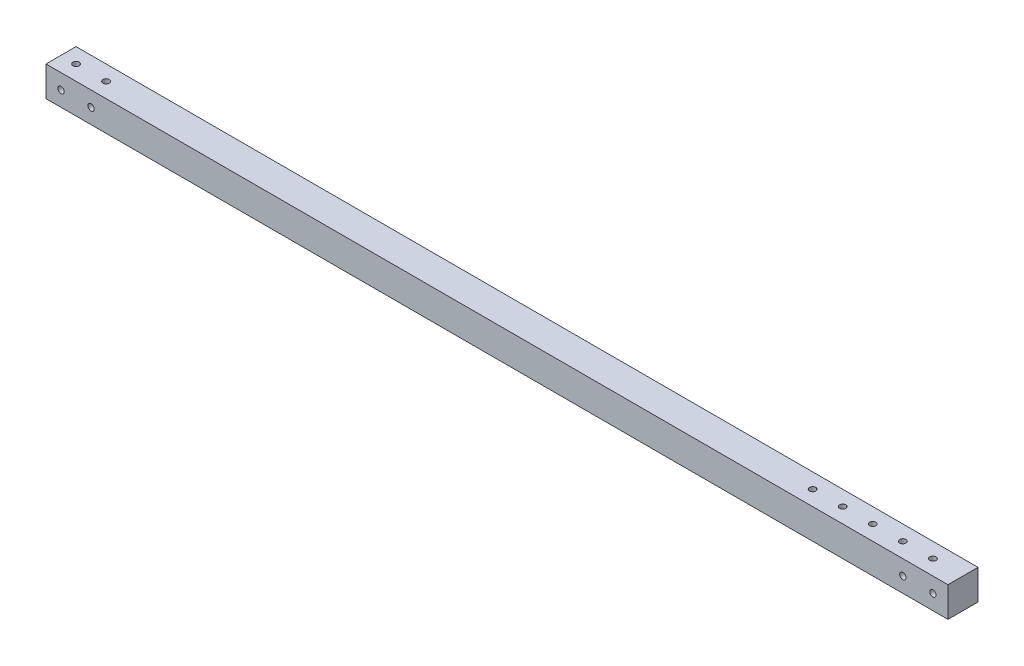
ISO-10303-21;
HEADER;
FILE_DESCRIPTION(('STEP AP214'),'2;1');
FILE_NAME('part.step','',(''),(''),'','','');
FILE_SCHEMA(('AUTOMOTIVE_DESIGN { 1 0 10303 214 1 1 1 1 }'));
ENDSEC;
DATA;
#1=APPLICATION_CONTEXT('core data for automotive mechanical design processes');
#2=APPLICATION_PROTOCOL_DEFINITION('international standard','automotive_design',2000,#1);
#3=PRODUCT_CONTEXT('',#1,'mechanical');
#4=PRODUCT('Part','Part','',(#3));
#5=PRODUCT_RELATED_PRODUCT_CATEGORY('part','',(#4));
#6=PRODUCT_DEFINITION_FORMATION('','',#4);
#7=PRODUCT_DEFINITION_CONTEXT('part definition',#1,'design');
#8=PRODUCT_DEFINITION('design','',#6,#7);
#9=PRODUCT_DEFINITION_SHAPE('','',#8);
#10=(LENGTH_UNIT() NAMED_UNIT(*) SI_UNIT(.MILLI.,.METRE.));
#11=(NAMED_UNIT(*) PLANE_ANGLE_UNIT() SI_UNIT($,.RADIAN.));
#12=(NAMED_UNIT(*) SI_UNIT($,.STERADIAN.) SOLID_ANGLE_UNIT());
#13=UNCERTAINTY_MEASURE_WITH_UNIT(LENGTH_MEASURE(1.E-05),#10,'distance_accuracy_value','');
#14=(GEOMETRIC_REPRESENTATION_CONTEXT(3) GLOBAL_UNCERTAINTY_ASSIGNED_CONTEXT((#13)) GLOBAL_UNIT_ASSIGNED_CONTEXT((#10,
#11,#12)) REPRESENTATION_CONTEXT('',''));
#15=CARTESIAN_POINT('',(0.,0.,0.));
#16=DIRECTION('',(0.,0.,1.));
#17=DIRECTION('',(1.,0.,0.));
#18=AXIS2_PLACEMENT_3D('',#15,#16,#17);
#19=CARTESIAN_POINT('',(30.,0.,-10.));
#20=DIRECTION('',(0.,0.,1.));
#21=DIRECTION('',(1.,0.,0.));
#22=AXIS2_PLACEMENT_3D('',#19,#20,#21);
#23=CYLINDRICAL_SURFACE('',#22,2.1);
#24=CARTESIAN_POINT('',(30.,0.,10.));
#25=DIRECTION('',(0.,0.,1.));
#26=DIRECTION('',(1.,0.,0.));
#27=AXIS2_PLACEMENT_3D('',#24,#25,#26);
#28=CIRCLE('',#27,2.1);
#29=CARTESIAN_POINT('',(32.1,0.,10.));
#30=VERTEX_POINT('',#29);
#31=EDGE_CURVE('E276',#30,#30,#28,.T.);
#32=ORIENTED_EDGE('',*,*,#31,.T.);
#33=EDGE_LOOP('',(#32));
#34=FACE_BOUND('',#33,.T.);
#35=CARTESIAN_POINT('',(30.,0.,0.));
#36=DIRECTION('',(0.,-0.707106781186547,0.707106781186547));
#37=DIRECTION('',(0.,0.707106781186547,0.707106781186547));
#38=AXIS2_PLACEMENT_3D('',#35,#36,#37);
#39=ELLIPSE('',#38,2.9698484809835,2.1);
#40=CARTESIAN_POINT('',(27.9,0.,0.));
#41=VERTEX_POINT('',#40);
#42=CARTESIAN_POINT('',(32.1,0.,0.));
#43=VERTEX_POINT('',#42);
#44=EDGE_CURVE('E52',#41,#43,#39,.F.);
#45=ORIENTED_EDGE('',*,*,#44,.T.);
#46=CARTESIAN_POINT('',(30.,0.,0.));
#47=DIRECTION('',(0.,0.707106781186547,0.707106781186547));
#48=DIRECTION('',(0.,-0.707106781186547,0.707106781186547));
#49=AXIS2_PLACEMENT_3D('',#46,#47,#48);
#50=ELLIPSE('',#49,2.9698484809835,2.1);
#51=EDGE_CURVE('E11',#43,#41,#50,.F.);
#52=ORIENTED_EDGE('',*,*,#51,.T.);
#53=EDGE_LOOP('',(#45,#52));
#54=FACE_BOUND('',#53,.T.);
#55=ADVANCED_FACE('F38',(#34,#54),#23,.F.);
#56=CARTESIAN_POINT('',(10.,0.,-10.));
#57=DIRECTION('',(0.,0.,1.));
#58=DIRECTION('',(1.,0.,0.));
#59=AXIS2_PLACEMENT_3D('',#56,#57,#58);
#60=CYLINDRICAL_SURFACE('',#59,2.1);
#61=CARTESIAN_POINT('',(10.,0.,10.));
#62=DIRECTION('',(0.,0.,1.));
#63=DIRECTION('',(1.,0.,0.));
#64=AXIS2_PLACEMENT_3D('',#61,#62,#63);
#65=CIRCLE('',#64,2.1);
#66=CARTESIAN_POINT('',(12.1,0.,10.));
#67=VERTEX_POINT('',#66);
#68=EDGE_CURVE('E263',#67,#67,#65,.T.);
#69=ORIENTED_EDGE('',*,*,#68,.T.);
#70=EDGE_LOOP('',(#69));
#71=FACE_BOUND('',#70,.T.);
#72=CARTESIAN_POINT('',(10.,0.,0.));
#73=DIRECTION('',(0.,-0.707106781186547,0.707106781186547));
#74=DIRECTION('',(0.,0.707106781186547,0.707106781186547));
#75=AXIS2_PLACEMENT_3D('',#72,#73,#74);
#76=ELLIPSE('',#75,2.9698484809835,2.1);
#77=CARTESIAN_POINT('',(7.9,0.,0.));
#78=VERTEX_POINT('',#77);
#79=CARTESIAN_POINT('',(12.1,0.,0.));
#80=VERTEX_POINT('',#79);
#81=EDGE_CURVE('E59',#78,#80,#76,.F.);
#82=ORIENTED_EDGE('',*,*,#81,.T.);
#83=CARTESIAN_POINT('',(10.,0.,0.));
#84=DIRECTION('',(0.,0.707106781186547,0.707106781186547));
#85=DIRECTION('',(0.,-0.707106781186547,0.707106781186547));
#86=AXIS2_PLACEMENT_3D('',#83,#84,#85);
#87=ELLIPSE('',#86,2.9698484809835,2.1);
#88=EDGE_CURVE('E95',#80,#78,#87,.F.);
#89=ORIENTED_EDGE('',*,*,#88,.T.);
#90=EDGE_LOOP('',(#82,#89));
#91=FACE_BOUND('',#90,.T.);
#92=ADVANCED_FACE('F106',(#71,#91),#60,.F.);
#93=CARTESIAN_POINT('',(600.,9.99999999999999,-10.));
#94=DIRECTION('',(0.,0.,1.));
#95=DIRECTION('',(1.,0.,0.));
#96=AXIS2_PLACEMENT_3D('',#93,#94,#95);
#97=PLANE('',#96);
#98=CARTESIAN_POINT('',(10.,0.,-10.));
#99=DIRECTION('',(0.,0.,1.));
#100=DIRECTION('',(1.,0.,0.));
#101=AXIS2_PLACEMENT_3D('',#98,#99,#100);
#102=CIRCLE('',#101,2.1);
#103=CARTESIAN_POINT('',(12.1,0.,-10.));
#104=VERTEX_POINT('',#103);
#105=EDGE_CURVE('E259',#104,#104,#102,.T.);
#106=ORIENTED_EDGE('',*,*,#105,.T.);
#107=EDGE_LOOP('',(#106));
#108=FACE_BOUND('',#107,.T.);
#109=CARTESIAN_POINT('',(30.,0.,-10.));
#110=DIRECTION('',(0.,0.,1.));
#111=DIRECTION('',(1.,0.,0.));
#112=AXIS2_PLACEMENT_3D('',#109,#110,#111);
#113=CIRCLE('',#112,2.1);
#114=CARTESIAN_POINT('',(32.1,0.,-10.));
#115=VERTEX_POINT('',#114);
#116=EDGE_CURVE('E268',#115,#115,#113,.T.);
#117=ORIENTED_EDGE('',*,*,#116,.T.);
#118=EDGE_LOOP('',(#117));
#119=FACE_BOUND('',#118,.T.);
#120=CARTESIAN_POINT('',(570.,0.,-10.));
#121=DIRECTION('',(0.,0.,1.));
#122=DIRECTION('',(-1.,0.,0.));
#123=AXIS2_PLACEMENT_3D('',#120,#121,#122);
#124=CIRCLE('',#123,2.10000000000015);
#125=CARTESIAN_POINT('',(567.9,0.,-10.));
#126=VERTEX_POINT('',#125);
#127=EDGE_CURVE('E279',#126,#126,#124,.T.);
#128=ORIENTED_EDGE('',*,*,#127,.T.);
#129=EDGE_LOOP('',(#128));
#130=FACE_BOUND('',#129,.T.);
#131=CARTESIAN_POINT('',(590.,0.,-10.));
#132=DIRECTION('',(0.,0.,1.));
#133=DIRECTION('',(-1.,0.,0.));
#134=AXIS2_PLACEMENT_3D('',#131,#132,#133);
#135=CIRCLE('',#134,2.10000000000004);
#136=CARTESIAN_POINT('',(587.9,0.,-10.));
#137=VERTEX_POINT('',#136);
#138=EDGE_CURVE('E286',#137,#137,#135,.T.);
#139=ORIENTED_EDGE('',*,*,#138,.T.);
#140=EDGE_LOOP('',(#139));
#141=FACE_BOUND('',#140,.T.);
#142=DIRECTION('',(0.,1.,0.));
#143=VECTOR('',#142,1.);
#144=CARTESIAN_POINT('',(0.,9.99999999999999,-10.));
#145=LINE('',#144,#143);
#146=CARTESIAN_POINT('',(0.,-10.,-10.));
#147=VERTEX_POINT('',#146);
#148=CARTESIAN_POINT('',(0.,9.99999999999999,-10.));
#149=VERTEX_POINT('',#148);
#150=EDGE_CURVE('E218',#147,#149,#145,.T.);
#151=ORIENTED_EDGE('',*,*,#150,.T.);
#152=DIRECTION('',(-1.,0.,0.));
#153=VECTOR('',#152,1.);
#154=CARTESIAN_POINT('',(600.,9.99999999999999,-10.));
#155=LINE('',#154,#153);
#156=CARTESIAN_POINT('',(600.,9.99999999999999,-10.));
#157=VERTEX_POINT('',#156);
#158=EDGE_CURVE('E104',#157,#149,#155,.T.);
#159=ORIENTED_EDGE('',*,*,#158,.F.);
#160=DIRECTION('',(0.,1.,0.));
#161=VECTOR('',#160,1.);
#162=CARTESIAN_POINT('',(600.,9.99999999999999,-10.));
#163=LINE('',#162,#161);
#164=CARTESIAN_POINT('',(600.,-10.,-10.));
#165=VERTEX_POINT('',#164);
#166=EDGE_CURVE('E232',#165,#157,#163,.T.);
#167=ORIENTED_EDGE('',*,*,#166,.F.);
#168=DIRECTION('',(-1.,0.,0.));
#169=VECTOR('',#168,1.);
#170=CARTESIAN_POINT('',(600.,-10.,-10.));
#171=LINE('',#170,#169);
#172=EDGE_CURVE('E236',#165,#147,#171,.T.);
#173=ORIENTED_EDGE('',*,*,#172,.T.);
#174=EDGE_LOOP('',(#151,#159,#167,#173));
#175=FACE_BOUND('',#174,.T.);
#176=ADVANCED_FACE('F40',(#108,#119,#130,#141,#175),#97,.F.);
#177=CARTESIAN_POINT('',(600.,9.99999999999999,10.));
#178=DIRECTION('',(0.,-1.,0.));
#179=DIRECTION('',(0.,0.,-1.));
#180=AXIS2_PLACEMENT_3D('',#177,#178,#179);
#181=PLANE('',#180);
#182=CARTESIAN_POINT('',(580.,9.99999999999999,0.));
#183=DIRECTION('',(0.,1.,0.));
#184=DIRECTION('',(0.,0.,1.));
#185=AXIS2_PLACEMENT_3D('',#182,#183,#184);
#186=CIRCLE('',#185,2.10000000000004);
#187=CARTESIAN_POINT('',(580.,9.99999999999999,2.10000000000004));
#188=VERTEX_POINT('',#187);
#189=EDGE_CURVE('E181',#188,#188,#186,.T.);
#190=ORIENTED_EDGE('',*,*,#189,.F.);
#191=EDGE_LOOP('',(#190));
#192=FACE_BOUND('',#191,.T.);
#193=CARTESIAN_POINT('',(560.,9.99999999999999,1.37924530077749E-13));
#194=DIRECTION('',(0.,1.,0.));
#195=DIRECTION('',(0.,0.,1.));
#196=AXIS2_PLACEMENT_3D('',#193,#194,#195);
#197=CIRCLE('',#196,2.10000000000004);
#198=CARTESIAN_POINT('',(560.,9.99999999999999,2.10000000000018));
#199=VERTEX_POINT('',#198);
#200=EDGE_CURVE('E185',#199,#199,#197,.T.);
#201=ORIENTED_EDGE('',*,*,#200,.F.);
#202=EDGE_LOOP('',(#201));
#203=FACE_BOUND('',#202,.T.);
#204=CARTESIAN_POINT('',(540.,9.99999999999999,2.77583783631474E-13));
#205=DIRECTION('',(0.,1.,0.));
#206=DIRECTION('',(0.,0.,1.));
#207=AXIS2_PLACEMENT_3D('',#204,#205,#206);
#208=CIRCLE('',#207,2.10000000000004);
#209=CARTESIAN_POINT('',(540.,9.99999999999999,2.10000000000032));
#210=VERTEX_POINT('',#209);
#211=EDGE_CURVE('E189',#210,#210,#208,.T.);
#212=ORIENTED_EDGE('',*,*,#211,.F.);
#213=EDGE_LOOP('',(#212));
#214=FACE_BOUND('',#213,.T.);
#215=CARTESIAN_POINT('',(520.,9.99999999999999,4.17243037185199E-13));
#216=DIRECTION('',(0.,1.,0.));
#217=DIRECTION('',(0.,0.,1.));
#218=AXIS2_PLACEMENT_3D('',#215,#216,#217);
#219=CIRCLE('',#218,2.09999999999994);
#220=CARTESIAN_POINT('',(520.,9.99999999999999,2.10000000000035));
#221=VERTEX_POINT('',#220);
#222=EDGE_CURVE('E193',#221,#221,#219,.T.);
#223=ORIENTED_EDGE('',*,*,#222,.F.);
#224=EDGE_LOOP('',(#223));
#225=FACE_BOUND('',#224,.T.);
#226=CARTESIAN_POINT('',(500.,9.99999999999999,5.56902290738925E-13));
#227=DIRECTION('',(0.,1.,0.));
#228=DIRECTION('',(0.,0.,1.));
#229=AXIS2_PLACEMENT_3D('',#226,#227,#228);
#230=CIRCLE('',#229,2.1000000000001);
#231=CARTESIAN_POINT('',(500.,9.99999999999999,2.10000000000065));
#232=VERTEX_POINT('',#231);
#233=EDGE_CURVE('E197',#232,#232,#230,.T.);
#234=ORIENTED_EDGE('',*,*,#233,.F.);
#235=EDGE_LOOP('',(#234));
#236=FACE_BOUND('',#235,.T.);
#237=CARTESIAN_POINT('',(10.,9.99999999999999,0.));
#238=DIRECTION('',(0.,1.,0.));
#239=DIRECTION('',(0.,0.,1.));
#240=AXIS2_PLACEMENT_3D('',#237,#238,#239);
#241=CIRCLE('',#240,2.1);
#242=CARTESIAN_POINT('',(10.,9.99999999999999,2.1));
#243=VERTEX_POINT('',#242);
#244=EDGE_CURVE('E201',#243,#243,#241,.T.);
#245=ORIENTED_EDGE('',*,*,#244,.F.);
#246=EDGE_LOOP('',(#245));
#247=FACE_BOUND('',#246,.T.);
#248=CARTESIAN_POINT('',(30.,9.99999999999999,0.));
#249=DIRECTION('',(0.,1.,0.));
#250=DIRECTION('',(0.,0.,1.));
#251=AXIS2_PLACEMENT_3D('',#248,#249,#250);
#252=CIRCLE('',#251,2.1);
#253=CARTESIAN_POINT('',(30.,9.99999999999999,2.1));
#254=VERTEX_POINT('',#253);
#255=EDGE_CURVE('E205',#254,#254,#252,.T.);
#256=ORIENTED_EDGE('',*,*,#255,.F.);
#257=EDGE_LOOP('',(#256));
#258=FACE_BOUND('',#257,.T.);
#259=DIRECTION('',(0.,0.,1.));
#260=VECTOR('',#259,1.);
#261=CARTESIAN_POINT('',(0.,9.99999999999999,10.));
#262=LINE('',#261,#260);
#263=CARTESIAN_POINT('',(0.,9.99999999999999,10.));
#264=VERTEX_POINT('',#263);
#265=EDGE_CURVE('E208',#149,#264,#262,.T.);
#266=ORIENTED_EDGE('',*,*,#265,.T.);
#267=DIRECTION('',(-1.,0.,0.));
#268=VECTOR('',#267,1.);
#269=CARTESIAN_POINT('',(600.,9.99999999999999,10.));
#270=LINE('',#269,#268);
#271=CARTESIAN_POINT('',(600.,9.99999999999999,10.));
#272=VERTEX_POINT('',#271);
#273=EDGE_CURVE('E210',#272,#264,#270,.T.);
#274=ORIENTED_EDGE('',*,*,#273,.F.);
#275=DIRECTION('',(0.,0.,1.));
#276=VECTOR('',#275,1.);
#277=CARTESIAN_POINT('',(600.,9.99999999999999,10.));
#278=LINE('',#277,#276);
#279=EDGE_CURVE('E248',#157,#272,#278,.T.);
#280=ORIENTED_EDGE('',*,*,#279,.F.);
#281=ORIENTED_EDGE('',*,*,#158,.T.);
#282=EDGE_LOOP('',(#266,#274,#280,#281));
#283=FACE_BOUND('',#282,.T.);
#284=ADVANCED_FACE('F169',(#192,#203,#214,#225,#236,#247,#258,#283),#181,.F.);
#285=CARTESIAN_POINT('',(600.,9.99999999999999,10.));
#286=DIRECTION('',(0.,0.,-1.));
#287=DIRECTION('',(0.,1.,0.));
#288=AXIS2_PLACEMENT_3D('',#285,#286,#287);
#289=PLANE('',#288);
#290=ORIENTED_EDGE('',*,*,#68,.F.);
#291=EDGE_LOOP('',(#290));
#292=FACE_BOUND('',#291,.T.);
#293=ORIENTED_EDGE('',*,*,#31,.F.);
#294=EDGE_LOOP('',(#293));
#295=FACE_BOUND('',#294,.T.);
#296=CARTESIAN_POINT('',(570.,0.,10.));
#297=DIRECTION('',(0.,0.,1.));
#298=DIRECTION('',(-1.,0.,0.));
#299=AXIS2_PLACEMENT_3D('',#296,#297,#298);
#300=CIRCLE('',#299,2.10000000000015);
#301=CARTESIAN_POINT('',(567.9,0.,10.));
#302=VERTEX_POINT('',#301);
#303=EDGE_CURVE('E283',#302,#302,#300,.T.);
#304=ORIENTED_EDGE('',*,*,#303,.F.);
#305=EDGE_LOOP('',(#304));
#306=FACE_BOUND('',#305,.T.);
#307=CARTESIAN_POINT('',(590.,0.,10.));
#308=DIRECTION('',(0.,0.,1.));
#309=DIRECTION('',(-1.,0.,0.));
#310=AXIS2_PLACEMENT_3D('',#307,#308,#309);
#311=CIRCLE('',#310,2.10000000000004);
#312=CARTESIAN_POINT('',(587.9,0.,10.));
#313=VERTEX_POINT('',#312);
#314=EDGE_CURVE('E256',#313,#313,#311,.T.);
#315=ORIENTED_EDGE('',*,*,#314,.F.);
#316=EDGE_LOOP('',(#315));
#317=FACE_BOUND('',#316,.T.);
#318=DIRECTION('',(0.,-1.,0.));
#319=VECTOR('',#318,1.);
#320=CARTESIAN_POINT('',(0.,9.99999999999999,10.));
#321=LINE('',#320,#319);
#322=CARTESIAN_POINT('',(0.,-10.,10.));
#323=VERTEX_POINT('',#322);
#324=EDGE_CURVE('E217',#264,#323,#321,.T.);
#325=ORIENTED_EDGE('',*,*,#324,.T.);
#326=DIRECTION('',(-1.,0.,0.));
#327=VECTOR('',#326,1.);
#328=CARTESIAN_POINT('',(600.,-10.,10.));
#329=LINE('',#328,#327);
#330=CARTESIAN_POINT('',(600.,-10.,10.));
#331=VERTEX_POINT('',#330);
#332=EDGE_CURVE('E225',#331,#323,#329,.T.);
#333=ORIENTED_EDGE('',*,*,#332,.F.);
#334=DIRECTION('',(0.,-1.,0.));
#335=VECTOR('',#334,1.);
#336=CARTESIAN_POINT('',(600.,9.99999999999999,10.));
#337=LINE('',#336,#335);
#338=EDGE_CURVE('E223',#272,#331,#337,.T.);
#339=ORIENTED_EDGE('',*,*,#338,.F.);
#340=ORIENTED_EDGE('',*,*,#273,.T.);
#341=EDGE_LOOP('',(#325,#333,#339,#340));
#342=FACE_BOUND('',#341,.T.);
#343=ADVANCED_FACE('F166',(#292,#295,#306,#317,#342),#289,.F.);
#344=CARTESIAN_POINT('',(600.,-10.,10.));
#345=DIRECTION('',(0.,1.,0.));
#346=DIRECTION('',(0.,0.,1.));
#347=AXIS2_PLACEMENT_3D('',#344,#345,#346);
#348=PLANE('',#347);
#349=CARTESIAN_POINT('',(580.,-10.,0.));
#350=DIRECTION('',(0.,1.,0.));
#351=DIRECTION('',(0.,0.,1.));
#352=AXIS2_PLACEMENT_3D('',#349,#350,#351);
#353=CIRCLE('',#352,2.10000000000004);
#354=CARTESIAN_POINT('',(580.,-10.,2.10000000000004));
#355=VERTEX_POINT('',#354);
#356=EDGE_CURVE('E311',#355,#355,#353,.T.);
#357=ORIENTED_EDGE('',*,*,#356,.T.);
#358=EDGE_LOOP('',(#357));
#359=FACE_BOUND('',#358,.T.);
#360=CARTESIAN_POINT('',(560.,-10.,1.37924530077749E-13));
#361=DIRECTION('',(0.,1.,0.));
#362=DIRECTION('',(0.,0.,1.));
#363=AXIS2_PLACEMENT_3D('',#360,#361,#362);
#364=CIRCLE('',#363,2.10000000000004);
#365=CARTESIAN_POINT('',(560.,-10.,2.10000000000018));
#366=VERTEX_POINT('',#365);
#367=EDGE_CURVE('E318',#366,#366,#364,.T.);
#368=ORIENTED_EDGE('',*,*,#367,.T.);
#369=EDGE_LOOP('',(#368));
#370=FACE_BOUND('',#369,.T.);
#371=CARTESIAN_POINT('',(540.,-10.,2.77583783631474E-13));
#372=DIRECTION('',(0.,1.,0.));
#373=DIRECTION('',(0.,0.,1.));
#374=AXIS2_PLACEMENT_3D('',#371,#372,#373);
#375=CIRCLE('',#374,2.10000000000004);
#376=CARTESIAN_POINT('',(540.,-10.,2.10000000000032));
#377=VERTEX_POINT('',#376);
#378=EDGE_CURVE('E326',#377,#377,#375,.T.);
#379=ORIENTED_EDGE('',*,*,#378,.T.);
#380=EDGE_LOOP('',(#379));
#381=FACE_BOUND('',#380,.T.);
#382=CARTESIAN_POINT('',(520.,-10.,4.17243037185199E-13));
#383=DIRECTION('',(0.,1.,0.));
#384=DIRECTION('',(0.,0.,1.));
#385=AXIS2_PLACEMENT_3D('',#382,#383,#384);
#386=CIRCLE('',#385,2.09999999999994);
#387=CARTESIAN_POINT('',(520.,-10.,2.10000000000035));
#388=VERTEX_POINT('',#387);
#389=EDGE_CURVE('E332',#388,#388,#386,.T.);
#390=ORIENTED_EDGE('',*,*,#389,.T.);
#391=EDGE_LOOP('',(#390));
#392=FACE_BOUND('',#391,.T.);
#393=CARTESIAN_POINT('',(500.,-10.,5.56902290738925E-13));
#394=DIRECTION('',(0.,1.,0.));
#395=DIRECTION('',(0.,0.,1.));
#396=AXIS2_PLACEMENT_3D('',#393,#394,#395);
#397=CIRCLE('',#396,2.1000000000001);
#398=CARTESIAN_POINT('',(500.,-10.,2.10000000000065));
#399=VERTEX_POINT('',#398);
#400=EDGE_CURVE('E337',#399,#399,#397,.T.);
#401=ORIENTED_EDGE('',*,*,#400,.T.);
#402=EDGE_LOOP('',(#401));
#403=FACE_BOUND('',#402,.T.);
#404=CARTESIAN_POINT('',(10.,-10.,0.));
#405=DIRECTION('',(0.,1.,0.));
#406=DIRECTION('',(0.,0.,1.));
#407=AXIS2_PLACEMENT_3D('',#404,#405,#406);
#408=CIRCLE('',#407,2.1);
#409=CARTESIAN_POINT('',(10.,-10.,2.1));
#410=VERTEX_POINT('',#409);
#411=EDGE_CURVE('E293',#410,#410,#408,.T.);
#412=ORIENTED_EDGE('',*,*,#411,.T.);
#413=EDGE_LOOP('',(#412));
#414=FACE_BOUND('',#413,.T.);
#415=CARTESIAN_POINT('',(30.,-10.,0.));
#416=DIRECTION('',(0.,1.,0.));
#417=DIRECTION('',(0.,0.,1.));
#418=AXIS2_PLACEMENT_3D('',#415,#416,#417);
#419=CIRCLE('',#418,2.1);
#420=CARTESIAN_POINT('',(30.,-10.,2.1));
#421=VERTEX_POINT('',#420);
#422=EDGE_CURVE('E302',#421,#421,#419,.T.);
#423=ORIENTED_EDGE('',*,*,#422,.T.);
#424=EDGE_LOOP('',(#423));
#425=FACE_BOUND('',#424,.T.);
#426=DIRECTION('',(0.,0.,-1.));
#427=VECTOR('',#426,1.);
#428=CARTESIAN_POINT('',(0.,-10.,10.));
#429=LINE('',#428,#427);
#430=EDGE_CURVE('E228',#323,#147,#429,.T.);
#431=ORIENTED_EDGE('',*,*,#430,.T.);
#432=ORIENTED_EDGE('',*,*,#172,.F.);
#433=DIRECTION('',(0.,0.,-1.));
#434=VECTOR('',#433,1.);
#435=CARTESIAN_POINT('',(600.,-10.,10.));
#436=LINE('',#435,#434);
#437=EDGE_CURVE('E240',#331,#165,#436,.T.);
#438=ORIENTED_EDGE('',*,*,#437,.F.);
#439=ORIENTED_EDGE('',*,*,#332,.T.);
#440=EDGE_LOOP('',(#431,#432,#438,#439));
#441=FACE_BOUND('',#440,.T.);
#442=ADVANCED_FACE('F159',(#359,#370,#381,#392,#403,#414,#425,#441),#348,.F.);
#443=CARTESIAN_POINT('',(600.,0.,0.));
#444=DIRECTION('',(1.,0.,0.));
#445=DIRECTION('',(0.,0.,-1.));
#446=AXIS2_PLACEMENT_3D('',#443,#444,#445);
#447=PLANE('',#446);
#448=ORIENTED_EDGE('',*,*,#166,.T.);
#449=ORIENTED_EDGE('',*,*,#279,.T.);
#450=ORIENTED_EDGE('',*,*,#338,.T.);
#451=ORIENTED_EDGE('',*,*,#437,.T.);
#452=EDGE_LOOP('',(#448,#449,#450,#451));
#453=FACE_BOUND('',#452,.T.);
#454=ADVANCED_FACE('F156',(#453),#447,.T.);
#455=CARTESIAN_POINT('',(0.,0.,0.));
#456=DIRECTION('',(1.,0.,0.));
#457=DIRECTION('',(0.,0.,-1.));
#458=AXIS2_PLACEMENT_3D('',#455,#456,#457);
#459=PLANE('',#458);
#460=ORIENTED_EDGE('',*,*,#150,.F.);
#461=ORIENTED_EDGE('',*,*,#430,.F.);
#462=ORIENTED_EDGE('',*,*,#324,.F.);
#463=ORIENTED_EDGE('',*,*,#265,.F.);
#464=EDGE_LOOP('',(#460,#461,#462,#463));
#465=FACE_BOUND('',#464,.T.);
#466=ADVANCED_FACE('F150',(#465),#459,.F.);
#467=CARTESIAN_POINT('',(590.,0.,-10.));
#468=DIRECTION('',(0.,0.,1.));
#469=DIRECTION('',(1.,0.,0.));
#470=AXIS2_PLACEMENT_3D('',#467,#468,#469);
#471=CYLINDRICAL_SURFACE('',#470,2.10000000000004);
#472=ORIENTED_EDGE('',*,*,#138,.F.);
#473=EDGE_LOOP('',(#472));
#474=FACE_BOUND('',#473,.T.);
#475=ORIENTED_EDGE('',*,*,#314,.T.);
#476=EDGE_LOOP('',(#475));
#477=FACE_BOUND('',#476,.T.);
#478=ADVANCED_FACE('F145',(#474,#477),#471,.F.);
#479=CARTESIAN_POINT('',(570.,0.,-10.));
#480=DIRECTION('',(0.,0.,1.));
#481=DIRECTION('',(1.,0.,0.));
#482=AXIS2_PLACEMENT_3D('',#479,#480,#481);
#483=CYLINDRICAL_SURFACE('',#482,2.10000000000015);
#484=ORIENTED_EDGE('',*,*,#127,.F.);
#485=EDGE_LOOP('',(#484));
#486=FACE_BOUND('',#485,.T.);
#487=ORIENTED_EDGE('',*,*,#303,.T.);
#488=EDGE_LOOP('',(#487));
#489=FACE_BOUND('',#488,.T.);
#490=ADVANCED_FACE('F140',(#486,#489),#483,.F.);
#491=CARTESIAN_POINT('',(30.,0.,0.));
#492=DIRECTION('',(0.,-0.707106781186547,0.707106781186547));
#493=DIRECTION('',(0.,0.707106781186547,0.707106781186547));
#494=AXIS2_PLACEMENT_3D('',#491,#492,#493);
#495=ELLIPSE('',#494,2.9698484809835,2.1);
#496=EDGE_CURVE('E116',#41,#43,#495,.T.);
#497=ORIENTED_EDGE('',*,*,#496,.T.);
#498=CARTESIAN_POINT('',(30.,0.,0.));
#499=DIRECTION('',(0.,0.707106781186547,0.707106781186547));
#500=DIRECTION('',(0.,-0.707106781186547,0.707106781186547));
#501=AXIS2_PLACEMENT_3D('',#498,#499,#500);
#502=ELLIPSE('',#501,2.9698484809835,2.1);
#503=EDGE_CURVE('E47',#43,#41,#502,.T.);
#504=ORIENTED_EDGE('',*,*,#503,.T.);
#505=EDGE_LOOP('',(#497,#504));
#506=FACE_BOUND('',#505,.T.);
#507=ORIENTED_EDGE('',*,*,#116,.F.);
#508=EDGE_LOOP('',(#507));
#509=FACE_BOUND('',#508,.T.);
#510=ADVANCED_FACE('F122',(#506,#509),#23,.F.);
#511=CARTESIAN_POINT('',(10.,0.,0.));
#512=DIRECTION('',(0.,-0.707106781186547,0.707106781186547));
#513=DIRECTION('',(0.,0.707106781186547,0.707106781186547));
#514=AXIS2_PLACEMENT_3D('',#511,#512,#513);
#515=ELLIPSE('',#514,2.9698484809835,2.1);
#516=EDGE_CURVE('E93',#78,#80,#515,.T.);
#517=ORIENTED_EDGE('',*,*,#516,.T.);
#518=CARTESIAN_POINT('',(10.,0.,0.));
#519=DIRECTION('',(0.,0.707106781186547,0.707106781186547));
#520=DIRECTION('',(0.,-0.707106781186547,0.707106781186547));
#521=AXIS2_PLACEMENT_3D('',#518,#519,#520);
#522=ELLIPSE('',#521,2.9698484809835,2.1);
#523=EDGE_CURVE('E99',#80,#78,#522,.T.);
#524=ORIENTED_EDGE('',*,*,#523,.T.);
#525=EDGE_LOOP('',(#517,#524));
#526=FACE_BOUND('',#525,.T.);
#527=ORIENTED_EDGE('',*,*,#105,.F.);
#528=EDGE_LOOP('',(#527));
#529=FACE_BOUND('',#528,.T.);
#530=ADVANCED_FACE('F109',(#526,#529),#60,.F.);
#531=CARTESIAN_POINT('',(10.,-10.,0.));
#532=DIRECTION('',(0.,1.,0.));
#533=DIRECTION('',(0.,0.,1.));
#534=AXIS2_PLACEMENT_3D('',#531,#532,#533);
#535=CYLINDRICAL_SURFACE('',#534,2.1);
#536=ORIENTED_EDGE('',*,*,#244,.T.);
#537=EDGE_LOOP('',(#536));
#538=FACE_BOUND('',#537,.T.);
#539=ORIENTED_EDGE('',*,*,#81,.F.);
#540=ORIENTED_EDGE('',*,*,#523,.F.);
#541=EDGE_LOOP('',(#539,#540));
#542=FACE_BOUND('',#541,.T.);
#543=ADVANCED_FACE('F102',(#538,#542),#535,.F.);
#544=ORIENTED_EDGE('',*,*,#411,.F.);
#545=EDGE_LOOP('',(#544));
#546=FACE_BOUND('',#545,.T.);
#547=ORIENTED_EDGE('',*,*,#516,.F.);
#548=ORIENTED_EDGE('',*,*,#88,.F.);
#549=EDGE_LOOP('',(#547,#548));
#550=FACE_BOUND('',#549,.T.);
#551=ADVANCED_FACE('F94',(#546,#550),#535,.F.);
#552=CARTESIAN_POINT('',(30.,-10.,0.));
#553=DIRECTION('',(0.,1.,0.));
#554=DIRECTION('',(0.,0.,1.));
#555=AXIS2_PLACEMENT_3D('',#552,#553,#554);
#556=CYLINDRICAL_SURFACE('',#555,2.1);
#557=ORIENTED_EDGE('',*,*,#255,.T.);
#558=EDGE_LOOP('',(#557));
#559=FACE_BOUND('',#558,.T.);
#560=ORIENTED_EDGE('',*,*,#44,.F.);
#561=ORIENTED_EDGE('',*,*,#503,.F.);
#562=EDGE_LOOP('',(#560,#561));
#563=FACE_BOUND('',#562,.T.);
#564=ADVANCED_FACE('F126',(#559,#563),#556,.F.);
#565=ORIENTED_EDGE('',*,*,#422,.F.);
#566=EDGE_LOOP('',(#565));
#567=FACE_BOUND('',#566,.T.);
#568=ORIENTED_EDGE('',*,*,#496,.F.);
#569=ORIENTED_EDGE('',*,*,#51,.F.);
#570=EDGE_LOOP('',(#568,#569));
#571=FACE_BOUND('',#570,.T.);
#572=ADVANCED_FACE('F128',(#567,#571),#556,.F.);
#573=CARTESIAN_POINT('',(500.,-10.,5.56902290738925E-13));
#574=DIRECTION('',(0.,1.,0.));
#575=DIRECTION('',(0.,0.,1.));
#576=AXIS2_PLACEMENT_3D('',#573,#574,#575);
#577=CYLINDRICAL_SURFACE('',#576,2.1000000000001);
#578=ORIENTED_EDGE('',*,*,#400,.F.);
#579=EDGE_LOOP('',(#578));
#580=FACE_BOUND('',#579,.T.);
#581=ORIENTED_EDGE('',*,*,#233,.T.);
#582=EDGE_LOOP('',(#581));
#583=FACE_BOUND('',#582,.T.);
#584=ADVANCED_FACE('F344',(#580,#583),#577,.F.);
#585=CARTESIAN_POINT('',(520.,-10.,4.17243037185199E-13));
#586=DIRECTION('',(0.,1.,0.));
#587=DIRECTION('',(0.,0.,1.));
#588=AXIS2_PLACEMENT_3D('',#585,#586,#587);
#589=CYLINDRICAL_SURFACE('',#588,2.09999999999994);
#590=ORIENTED_EDGE('',*,*,#389,.F.);
#591=EDGE_LOOP('',(#590));
#592=FACE_BOUND('',#591,.T.);
#593=ORIENTED_EDGE('',*,*,#222,.T.);
#594=EDGE_LOOP('',(#593));
#595=FACE_BOUND('',#594,.T.);
#596=ADVANCED_FACE('F346',(#592,#595),#589,.F.);
#597=CARTESIAN_POINT('',(540.,-10.,2.77583783631474E-13));
#598=DIRECTION('',(0.,1.,0.));
#599=DIRECTION('',(0.,0.,1.));
#600=AXIS2_PLACEMENT_3D('',#597,#598,#599);
#601=CYLINDRICAL_SURFACE('',#600,2.10000000000004);
#602=ORIENTED_EDGE('',*,*,#378,.F.);
#603=EDGE_LOOP('',(#602));
#604=FACE_BOUND('',#603,.T.);
#605=ORIENTED_EDGE('',*,*,#211,.T.);
#606=EDGE_LOOP('',(#605));
#607=FACE_BOUND('',#606,.T.);
#608=ADVANCED_FACE('F353',(#604,#607),#601,.F.);
#609=CARTESIAN_POINT('',(560.,-10.,1.37924530077749E-13));
#610=DIRECTION('',(0.,1.,0.));
#611=DIRECTION('',(0.,0.,1.));
#612=AXIS2_PLACEMENT_3D('',#609,#610,#611);
#613=CYLINDRICAL_SURFACE('',#612,2.10000000000004);
#614=ORIENTED_EDGE('',*,*,#367,.F.);
#615=EDGE_LOOP('',(#614));
#616=FACE_BOUND('',#615,.T.);
#617=ORIENTED_EDGE('',*,*,#200,.T.);
#618=EDGE_LOOP('',(#617));
#619=FACE_BOUND('',#618,.T.);
#620=ADVANCED_FACE('F448',(#616,#619),#613,.F.);
#621=CARTESIAN_POINT('',(580.,-10.,0.));
#622=DIRECTION('',(0.,1.,0.));
#623=DIRECTION('',(0.,0.,1.));
#624=AXIS2_PLACEMENT_3D('',#621,#622,#623);
#625=CYLINDRICAL_SURFACE('',#624,2.10000000000004);
#626=ORIENTED_EDGE('',*,*,#356,.F.);
#627=EDGE_LOOP('',(#626));
#628=FACE_BOUND('',#627,.T.);
#629=ORIENTED_EDGE('',*,*,#189,.T.);
#630=EDGE_LOOP('',(#629));
#631=FACE_BOUND('',#630,.T.);
#632=ADVANCED_FACE('F457',(#628,#631),#625,.F.);
#633=CLOSED_SHELL('',(#55,#92,#176,#284,#343,#442,#454,#466,#478,#490,#510,#530,#543,#551,#564,
#572,#584,#596,#608,#620,#632));
#634=MANIFOLD_SOLID_BREP('B2',#633);
#635=ADVANCED_BREP_SHAPE_REPRESENTATION('',(#18,#634),#14);
#636=SHAPE_DEFINITION_REPRESENTATION(#9,#635);
ENDSEC;
END-ISO-10303-21;
